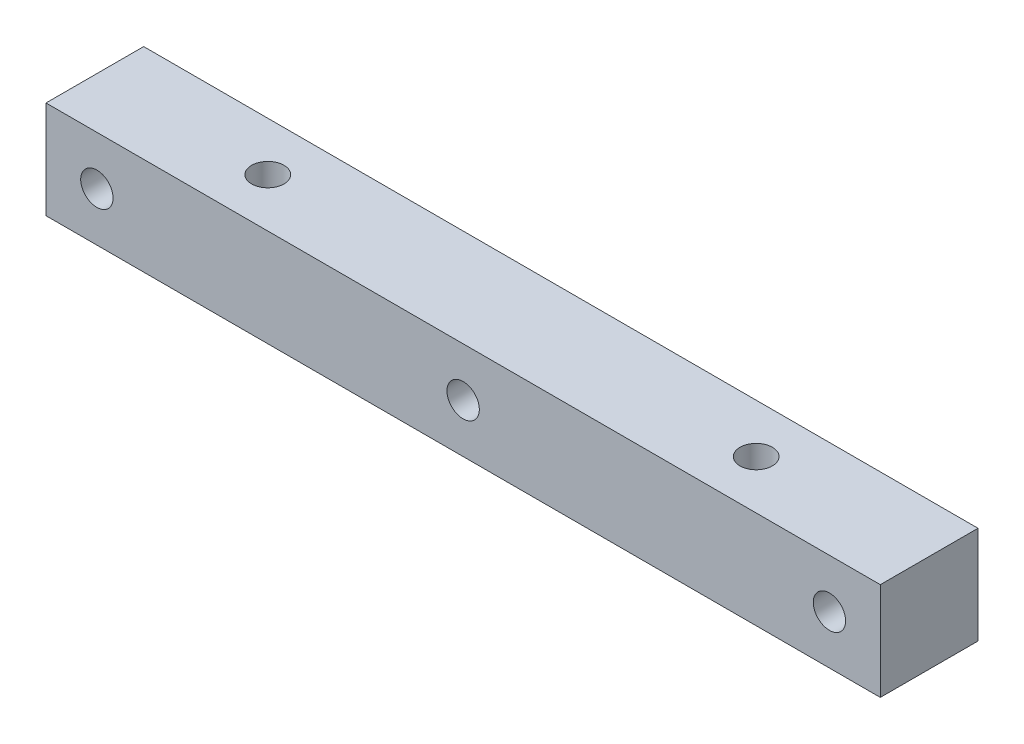
ISO-10303-21;
HEADER;
FILE_DESCRIPTION(('STEP AP214'),'2;1');
FILE_NAME('part.step','',(''),(''),'','','');
FILE_SCHEMA(('AUTOMOTIVE_DESIGN { 1 0 10303 214 1 1 1 1 }'));
ENDSEC;
DATA;
#1=APPLICATION_CONTEXT('core data for automotive mechanical design processes');
#2=APPLICATION_PROTOCOL_DEFINITION('international standard','automotive_design',2000,#1);
#3=PRODUCT_CONTEXT('',#1,'mechanical');
#4=PRODUCT('Part','Part','',(#3));
#5=PRODUCT_RELATED_PRODUCT_CATEGORY('part','',(#4));
#6=PRODUCT_DEFINITION_FORMATION('','',#4);
#7=PRODUCT_DEFINITION_CONTEXT('part definition',#1,'design');
#8=PRODUCT_DEFINITION('design','',#6,#7);
#9=PRODUCT_DEFINITION_SHAPE('','',#8);
#10=(LENGTH_UNIT() NAMED_UNIT(*) SI_UNIT(.MILLI.,.METRE.));
#11=(NAMED_UNIT(*) PLANE_ANGLE_UNIT() SI_UNIT($,.RADIAN.));
#12=(NAMED_UNIT(*) SI_UNIT($,.STERADIAN.) SOLID_ANGLE_UNIT());
#13=UNCERTAINTY_MEASURE_WITH_UNIT(LENGTH_MEASURE(1.E-05),#10,'distance_accuracy_value','');
#14=(GEOMETRIC_REPRESENTATION_CONTEXT(3) GLOBAL_UNCERTAINTY_ASSIGNED_CONTEXT((#13)) GLOBAL_UNIT_ASSIGNED_CONTEXT((#10,
#11,#12)) REPRESENTATION_CONTEXT('',''));
#15=CARTESIAN_POINT('',(0.,0.,0.));
#16=DIRECTION('',(0.,0.,1.));
#17=DIRECTION('',(1.,0.,0.));
#18=AXIS2_PLACEMENT_3D('',#15,#16,#17);
#19=CARTESIAN_POINT('',(52.07,-6.096,-6.096));
#20=DIRECTION('',(0.,1.,0.));
#21=DIRECTION('',(0.,0.,1.));
#22=AXIS2_PLACEMENT_3D('',#19,#20,#21);
#23=PLANE('',#22);
#24=CARTESIAN_POINT('',(-30.48,-6.096,0.));
#25=DIRECTION('',(0.,1.,0.));
#26=DIRECTION('',(0.,0.,1.));
#27=AXIS2_PLACEMENT_3D('',#24,#25,#26);
#28=CIRCLE('',#27,2.0193);
#29=CARTESIAN_POINT('',(-30.48,-6.096,2.0193));
#30=VERTEX_POINT('',#29);
#31=EDGE_CURVE('E162',#30,#30,#28,.T.);
#32=ORIENTED_EDGE('',*,*,#31,.T.);
#33=EDGE_LOOP('',(#32));
#34=FACE_BOUND('',#33,.T.);
#35=CARTESIAN_POINT('',(30.48,-6.096,0.));
#36=DIRECTION('',(0.,1.,0.));
#37=DIRECTION('',(0.,0.,1.));
#38=AXIS2_PLACEMENT_3D('',#35,#36,#37);
#39=CIRCLE('',#38,2.0193);
#40=CARTESIAN_POINT('',(30.48,-6.096,2.01929999999999));
#41=VERTEX_POINT('',#40);
#42=EDGE_CURVE('E154',#41,#41,#39,.T.);
#43=ORIENTED_EDGE('',*,*,#42,.T.);
#44=EDGE_LOOP('',(#43));
#45=FACE_BOUND('',#44,.T.);
#46=DIRECTION('',(0.,0.,-1.));
#47=VECTOR('',#46,1.);
#48=CARTESIAN_POINT('',(-52.07,-6.096,-6.096));
#49=LINE('',#48,#47);
#50=CARTESIAN_POINT('',(-52.07,-6.096,6.096));
#51=VERTEX_POINT('',#50);
#52=CARTESIAN_POINT('',(-52.07,-6.096,-6.096));
#53=VERTEX_POINT('',#52);
#54=EDGE_CURVE('E110',#51,#53,#49,.T.);
#55=ORIENTED_EDGE('',*,*,#54,.T.);
#56=DIRECTION('',(-1.,0.,0.));
#57=VECTOR('',#56,1.);
#58=CARTESIAN_POINT('',(52.07,-6.096,-6.096));
#59=LINE('',#58,#57);
#60=CARTESIAN_POINT('',(52.07,-6.096,-6.096));
#61=VERTEX_POINT('',#60);
#62=EDGE_CURVE('E11',#61,#53,#59,.T.);
#63=ORIENTED_EDGE('',*,*,#62,.F.);
#64=DIRECTION('',(0.,0.,-1.));
#65=VECTOR('',#64,1.);
#66=CARTESIAN_POINT('',(52.07,-6.096,-6.096));
#67=LINE('',#66,#65);
#68=CARTESIAN_POINT('',(52.07,-6.096,6.096));
#69=VERTEX_POINT('',#68);
#70=EDGE_CURVE('E94',#69,#61,#67,.T.);
#71=ORIENTED_EDGE('',*,*,#70,.F.);
#72=DIRECTION('',(-1.,0.,0.));
#73=VECTOR('',#72,1.);
#74=CARTESIAN_POINT('',(52.07,-6.096,6.096));
#75=LINE('',#74,#73);
#76=EDGE_CURVE('E106',#69,#51,#75,.T.);
#77=ORIENTED_EDGE('',*,*,#76,.T.);
#78=EDGE_LOOP('',(#55,#63,#71,#77));
#79=FACE_BOUND('',#78,.T.);
#80=ADVANCED_FACE('F42',(#34,#45,#79),#23,.F.);
#81=CARTESIAN_POINT('',(52.07,6.096,-6.096));
#82=DIRECTION('',(0.,0.,1.));
#83=DIRECTION('',(1.,0.,0.));
#84=AXIS2_PLACEMENT_3D('',#81,#82,#83);
#85=PLANE('',#84);
#86=CARTESIAN_POINT('',(-45.72,0.,-6.096));
#87=DIRECTION('',(0.,0.,1.));
#88=DIRECTION('',(1.,0.,0.));
#89=AXIS2_PLACEMENT_3D('',#86,#87,#88);
#90=CIRCLE('',#89,2.01929999999999);
#91=CARTESIAN_POINT('',(-43.7007,0.,-6.096));
#92=VERTEX_POINT('',#91);
#93=EDGE_CURVE('E146',#92,#92,#90,.T.);
#94=ORIENTED_EDGE('',*,*,#93,.T.);
#95=EDGE_LOOP('',(#94));
#96=FACE_BOUND('',#95,.T.);
#97=CARTESIAN_POINT('',(45.72,0.,-6.096));
#98=DIRECTION('',(0.,0.,1.));
#99=DIRECTION('',(1.,0.,0.));
#100=AXIS2_PLACEMENT_3D('',#97,#98,#99);
#101=CIRCLE('',#100,2.01929999999999);
#102=CARTESIAN_POINT('',(47.7393,0.,-6.096));
#103=VERTEX_POINT('',#102);
#104=EDGE_CURVE('E138',#103,#103,#101,.T.);
#105=ORIENTED_EDGE('',*,*,#104,.T.);
#106=EDGE_LOOP('',(#105));
#107=FACE_BOUND('',#106,.T.);
#108=CARTESIAN_POINT('',(0.,0.,-6.096));
#109=DIRECTION('',(0.,0.,1.));
#110=DIRECTION('',(1.,0.,0.));
#111=AXIS2_PLACEMENT_3D('',#108,#109,#110);
#112=CIRCLE('',#111,2.0193);
#113=CARTESIAN_POINT('',(2.0193,0.,-6.096));
#114=VERTEX_POINT('',#113);
#115=EDGE_CURVE('E114',#114,#114,#112,.T.);
#116=ORIENTED_EDGE('',*,*,#115,.T.);
#117=EDGE_LOOP('',(#116));
#118=FACE_BOUND('',#117,.T.);
#119=DIRECTION('',(0.,1.,0.));
#120=VECTOR('',#119,1.);
#121=CARTESIAN_POINT('',(-52.07,6.096,-6.096));
#122=LINE('',#121,#120);
#123=CARTESIAN_POINT('',(-52.07,6.096,-6.096));
#124=VERTEX_POINT('',#123);
#125=EDGE_CURVE('E99',#53,#124,#122,.T.);
#126=ORIENTED_EDGE('',*,*,#125,.T.);
#127=DIRECTION('',(-1.,0.,0.));
#128=VECTOR('',#127,1.);
#129=CARTESIAN_POINT('',(52.07,6.096,-6.096));
#130=LINE('',#129,#128);
#131=CARTESIAN_POINT('',(52.07,6.096,-6.096));
#132=VERTEX_POINT('',#131);
#133=EDGE_CURVE('E51',#132,#124,#130,.T.);
#134=ORIENTED_EDGE('',*,*,#133,.F.);
#135=DIRECTION('',(0.,1.,0.));
#136=VECTOR('',#135,1.);
#137=CARTESIAN_POINT('',(52.07,6.096,-6.096));
#138=LINE('',#137,#136);
#139=EDGE_CURVE('E89',#61,#132,#138,.T.);
#140=ORIENTED_EDGE('',*,*,#139,.F.);
#141=ORIENTED_EDGE('',*,*,#62,.T.);
#142=EDGE_LOOP('',(#126,#134,#140,#141));
#143=FACE_BOUND('',#142,.T.);
#144=ADVANCED_FACE('F98',(#96,#107,#118,#143),#85,.F.);
#145=CARTESIAN_POINT('',(52.07,6.096,-6.096));
#146=DIRECTION('',(0.,-1.,0.));
#147=DIRECTION('',(0.,0.,-1.));
#148=AXIS2_PLACEMENT_3D('',#145,#146,#147);
#149=PLANE('',#148);
#150=CARTESIAN_POINT('',(-30.48,6.096,0.));
#151=DIRECTION('',(0.,1.,0.));
#152=DIRECTION('',(0.,0.,1.));
#153=AXIS2_PLACEMENT_3D('',#150,#151,#152);
#154=CIRCLE('',#153,2.01929999999999);
#155=CARTESIAN_POINT('',(-30.48,6.096,2.01929999999999));
#156=VERTEX_POINT('',#155);
#157=EDGE_CURVE('E166',#156,#156,#154,.T.);
#158=ORIENTED_EDGE('',*,*,#157,.F.);
#159=EDGE_LOOP('',(#158));
#160=FACE_BOUND('',#159,.T.);
#161=CARTESIAN_POINT('',(30.48,6.096,0.));
#162=DIRECTION('',(0.,1.,0.));
#163=DIRECTION('',(0.,0.,1.));
#164=AXIS2_PLACEMENT_3D('',#161,#162,#163);
#165=CIRCLE('',#164,2.01929999999998);
#166=CARTESIAN_POINT('',(30.48,6.096,2.01929999999997));
#167=VERTEX_POINT('',#166);
#168=EDGE_CURVE('E158',#167,#167,#165,.T.);
#169=ORIENTED_EDGE('',*,*,#168,.F.);
#170=EDGE_LOOP('',(#169));
#171=FACE_BOUND('',#170,.T.);
#172=DIRECTION('',(0.,0.,1.));
#173=VECTOR('',#172,1.);
#174=CARTESIAN_POINT('',(-52.07,6.096,-6.096));
#175=LINE('',#174,#173);
#176=CARTESIAN_POINT('',(-52.07,6.096,6.096));
#177=VERTEX_POINT('',#176);
#178=EDGE_CURVE('E76',#124,#177,#175,.T.);
#179=ORIENTED_EDGE('',*,*,#178,.T.);
#180=DIRECTION('',(-1.,0.,0.));
#181=VECTOR('',#180,1.);
#182=CARTESIAN_POINT('',(52.07,6.096,6.096));
#183=LINE('',#182,#181);
#184=CARTESIAN_POINT('',(52.07,6.096,6.096));
#185=VERTEX_POINT('',#184);
#186=EDGE_CURVE('E101',#185,#177,#183,.T.);
#187=ORIENTED_EDGE('',*,*,#186,.F.);
#188=DIRECTION('',(0.,0.,1.));
#189=VECTOR('',#188,1.);
#190=CARTESIAN_POINT('',(52.07,6.096,-6.096));
#191=LINE('',#190,#189);
#192=EDGE_CURVE('E92',#132,#185,#191,.T.);
#193=ORIENTED_EDGE('',*,*,#192,.F.);
#194=ORIENTED_EDGE('',*,*,#133,.T.);
#195=EDGE_LOOP('',(#179,#187,#193,#194));
#196=FACE_BOUND('',#195,.T.);
#197=ADVANCED_FACE('F102',(#160,#171,#196),#149,.F.);
#198=CARTESIAN_POINT('',(52.07,6.096,6.096));
#199=DIRECTION('',(0.,0.,-1.));
#200=DIRECTION('',(-1.,0.,0.));
#201=AXIS2_PLACEMENT_3D('',#198,#199,#200);
#202=PLANE('',#201);
#203=CARTESIAN_POINT('',(-45.72,0.,6.096));
#204=DIRECTION('',(0.,0.,1.));
#205=DIRECTION('',(1.,0.,0.));
#206=AXIS2_PLACEMENT_3D('',#203,#204,#205);
#207=CIRCLE('',#206,2.01929999999999);
#208=CARTESIAN_POINT('',(-43.7007,0.,6.096));
#209=VERTEX_POINT('',#208);
#210=EDGE_CURVE('E150',#209,#209,#207,.T.);
#211=ORIENTED_EDGE('',*,*,#210,.F.);
#212=EDGE_LOOP('',(#211));
#213=FACE_BOUND('',#212,.T.);
#214=CARTESIAN_POINT('',(45.72,0.,6.096));
#215=DIRECTION('',(0.,0.,1.));
#216=DIRECTION('',(1.,0.,0.));
#217=AXIS2_PLACEMENT_3D('',#214,#215,#216);
#218=CIRCLE('',#217,2.01929999999999);
#219=CARTESIAN_POINT('',(47.7393,0.,6.096));
#220=VERTEX_POINT('',#219);
#221=EDGE_CURVE('E142',#220,#220,#218,.T.);
#222=ORIENTED_EDGE('',*,*,#221,.F.);
#223=EDGE_LOOP('',(#222));
#224=FACE_BOUND('',#223,.T.);
#225=CARTESIAN_POINT('',(0.,0.,6.096));
#226=DIRECTION('',(0.,0.,1.));
#227=DIRECTION('',(1.,0.,0.));
#228=AXIS2_PLACEMENT_3D('',#225,#226,#227);
#229=CIRCLE('',#228,2.01929999999999);
#230=CARTESIAN_POINT('',(2.01929999999999,0.,6.096));
#231=VERTEX_POINT('',#230);
#232=EDGE_CURVE('E134',#231,#231,#229,.T.);
#233=ORIENTED_EDGE('',*,*,#232,.F.);
#234=EDGE_LOOP('',(#233));
#235=FACE_BOUND('',#234,.T.);
#236=DIRECTION('',(0.,-1.,0.));
#237=VECTOR('',#236,1.);
#238=CARTESIAN_POINT('',(-52.07,6.096,6.096));
#239=LINE('',#238,#237);
#240=EDGE_CURVE('E82',#177,#51,#239,.T.);
#241=ORIENTED_EDGE('',*,*,#240,.T.);
#242=ORIENTED_EDGE('',*,*,#76,.F.);
#243=DIRECTION('',(0.,-1.,0.));
#244=VECTOR('',#243,1.);
#245=CARTESIAN_POINT('',(52.07,6.096,6.096));
#246=LINE('',#245,#244);
#247=EDGE_CURVE('E59',#185,#69,#246,.T.);
#248=ORIENTED_EDGE('',*,*,#247,.F.);
#249=ORIENTED_EDGE('',*,*,#186,.T.);
#250=EDGE_LOOP('',(#241,#242,#248,#249));
#251=FACE_BOUND('',#250,.T.);
#252=ADVANCED_FACE('F124',(#213,#224,#235,#251),#202,.F.);
#253=CARTESIAN_POINT('',(52.07,0.,0.));
#254=DIRECTION('',(1.,0.,0.));
#255=DIRECTION('',(0.,0.,-1.));
#256=AXIS2_PLACEMENT_3D('',#253,#254,#255);
#257=PLANE('',#256);
#258=ORIENTED_EDGE('',*,*,#70,.T.);
#259=ORIENTED_EDGE('',*,*,#139,.T.);
#260=ORIENTED_EDGE('',*,*,#192,.T.);
#261=ORIENTED_EDGE('',*,*,#247,.T.);
#262=EDGE_LOOP('',(#258,#259,#260,#261));
#263=FACE_BOUND('',#262,.T.);
#264=ADVANCED_FACE('F90',(#263),#257,.T.);
#265=CARTESIAN_POINT('',(-52.07,0.,0.));
#266=DIRECTION('',(1.,0.,0.));
#267=DIRECTION('',(0.,0.,-1.));
#268=AXIS2_PLACEMENT_3D('',#265,#266,#267);
#269=PLANE('',#268);
#270=ORIENTED_EDGE('',*,*,#54,.F.);
#271=ORIENTED_EDGE('',*,*,#240,.F.);
#272=ORIENTED_EDGE('',*,*,#178,.F.);
#273=ORIENTED_EDGE('',*,*,#125,.F.);
#274=EDGE_LOOP('',(#270,#271,#272,#273));
#275=FACE_BOUND('',#274,.T.);
#276=ADVANCED_FACE('F127',(#275),#269,.F.);
#277=CARTESIAN_POINT('',(0.,0.,6.096));
#278=DIRECTION('',(0.,0.,1.));
#279=DIRECTION('',(1.,0.,0.));
#280=AXIS2_PLACEMENT_3D('',#277,#278,#279);
#281=CYLINDRICAL_SURFACE('',#280,2.01929999999999);
#282=ORIENTED_EDGE('',*,*,#115,.F.);
#283=EDGE_LOOP('',(#282));
#284=FACE_BOUND('',#283,.T.);
#285=ORIENTED_EDGE('',*,*,#232,.T.);
#286=EDGE_LOOP('',(#285));
#287=FACE_BOUND('',#286,.T.);
#288=ADVANCED_FACE('F210',(#284,#287),#281,.F.);
#289=CARTESIAN_POINT('',(45.72,0.,6.096));
#290=DIRECTION('',(0.,0.,1.));
#291=DIRECTION('',(1.,0.,0.));
#292=AXIS2_PLACEMENT_3D('',#289,#290,#291);
#293=CYLINDRICAL_SURFACE('',#292,2.01929999999999);
#294=ORIENTED_EDGE('',*,*,#104,.F.);
#295=EDGE_LOOP('',(#294));
#296=FACE_BOUND('',#295,.T.);
#297=ORIENTED_EDGE('',*,*,#221,.T.);
#298=EDGE_LOOP('',(#297));
#299=FACE_BOUND('',#298,.T.);
#300=ADVANCED_FACE('F189',(#296,#299),#293,.F.);
#301=CARTESIAN_POINT('',(-45.72,0.,6.096));
#302=DIRECTION('',(0.,0.,1.));
#303=DIRECTION('',(1.,0.,0.));
#304=AXIS2_PLACEMENT_3D('',#301,#302,#303);
#305=CYLINDRICAL_SURFACE('',#304,2.01929999999999);
#306=ORIENTED_EDGE('',*,*,#93,.F.);
#307=EDGE_LOOP('',(#306));
#308=FACE_BOUND('',#307,.T.);
#309=ORIENTED_EDGE('',*,*,#210,.T.);
#310=EDGE_LOOP('',(#309));
#311=FACE_BOUND('',#310,.T.);
#312=ADVANCED_FACE('F180',(#308,#311),#305,.F.);
#313=CARTESIAN_POINT('',(30.48,6.096,0.));
#314=DIRECTION('',(0.,1.,0.));
#315=DIRECTION('',(0.,0.,1.));
#316=AXIS2_PLACEMENT_3D('',#313,#314,#315);
#317=CYLINDRICAL_SURFACE('',#316,2.01929999999999);
#318=ORIENTED_EDGE('',*,*,#42,.F.);
#319=EDGE_LOOP('',(#318));
#320=FACE_BOUND('',#319,.T.);
#321=ORIENTED_EDGE('',*,*,#168,.T.);
#322=EDGE_LOOP('',(#321));
#323=FACE_BOUND('',#322,.T.);
#324=ADVANCED_FACE('F178',(#320,#323),#317,.F.);
#325=CARTESIAN_POINT('',(-30.48,6.096,0.));
#326=DIRECTION('',(0.,1.,0.));
#327=DIRECTION('',(0.,0.,1.));
#328=AXIS2_PLACEMENT_3D('',#325,#326,#327);
#329=CYLINDRICAL_SURFACE('',#328,2.01929999999999);
#330=ORIENTED_EDGE('',*,*,#31,.F.);
#331=EDGE_LOOP('',(#330));
#332=FACE_BOUND('',#331,.T.);
#333=ORIENTED_EDGE('',*,*,#157,.T.);
#334=EDGE_LOOP('',(#333));
#335=FACE_BOUND('',#334,.T.);
#336=ADVANCED_FACE('F171',(#332,#335),#329,.F.);
#337=CLOSED_SHELL('',(#80,#144,#197,#252,#264,#276,#288,#300,#312,#324,#336));
#338=MANIFOLD_SOLID_BREP('B2',#337);
#339=ADVANCED_BREP_SHAPE_REPRESENTATION('',(#18,#338),#14);
#340=SHAPE_DEFINITION_REPRESENTATION(#9,#339);
ENDSEC;
END-ISO-10303-21;
